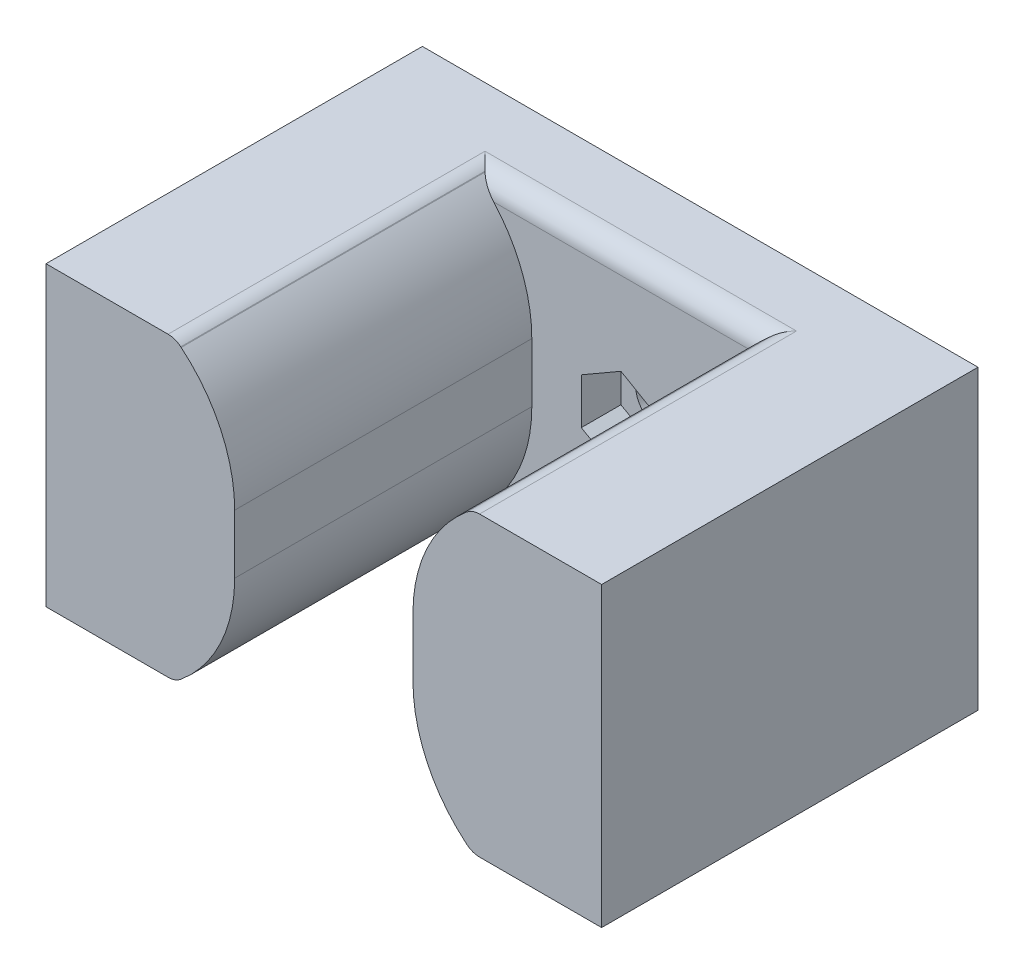
ISO-10303-21;
HEADER;
FILE_DESCRIPTION(('STEP AP214'),'2;1');
FILE_NAME('part.step','',(''),(''),'','','');
FILE_SCHEMA(('AUTOMOTIVE_DESIGN { 1 0 10303 214 1 1 1 1 }'));
ENDSEC;
DATA;
#1=APPLICATION_CONTEXT('core data for automotive mechanical design processes');
#2=APPLICATION_PROTOCOL_DEFINITION('international standard','automotive_design',2000,#1);
#3=PRODUCT_CONTEXT('',#1,'mechanical');
#4=PRODUCT('Part','Part','',(#3));
#5=PRODUCT_RELATED_PRODUCT_CATEGORY('part','',(#4));
#6=PRODUCT_DEFINITION_FORMATION('','',#4);
#7=PRODUCT_DEFINITION_CONTEXT('part definition',#1,'design');
#8=PRODUCT_DEFINITION('design','',#6,#7);
#9=PRODUCT_DEFINITION_SHAPE('','',#8);
#10=(LENGTH_UNIT() NAMED_UNIT(*) SI_UNIT(.MILLI.,.METRE.));
#11=(NAMED_UNIT(*) PLANE_ANGLE_UNIT() SI_UNIT($,.RADIAN.));
#12=(NAMED_UNIT(*) SI_UNIT($,.STERADIAN.) SOLID_ANGLE_UNIT());
#13=UNCERTAINTY_MEASURE_WITH_UNIT(LENGTH_MEASURE(1.E-05),#10,'distance_accuracy_value','');
#14=(GEOMETRIC_REPRESENTATION_CONTEXT(3) GLOBAL_UNCERTAINTY_ASSIGNED_CONTEXT((#13)) GLOBAL_UNIT_ASSIGNED_CONTEXT((#10,
#11,#12)) REPRESENTATION_CONTEXT('',''));
#15=CARTESIAN_POINT('',(0.,0.,0.));
#16=DIRECTION('',(0.,0.,1.));
#17=DIRECTION('',(1.,0.,0.));
#18=AXIS2_PLACEMENT_3D('',#15,#16,#17);
#19=CARTESIAN_POINT('',(0.,0.,8.));
#20=DIRECTION('',(0.,0.,-1.));
#21=DIRECTION('',(-1.,0.,0.));
#22=AXIS2_PLACEMENT_3D('',#19,#20,#21);
#23=PLANE('',#22);
#24=DIRECTION('',(-0.866025403784438,-0.5,0.));
#25=VECTOR('',#24,1.);
#26=CARTESIAN_POINT('',(28.05,19.618802153517,8.));
#27=LINE('',#26,#25);
#28=CARTESIAN_POINT('',(28.05,19.618802153517,8.));
#29=VERTEX_POINT('',#28);
#30=CARTESIAN_POINT('',(24.05,17.3094010767585,8.));
#31=VERTEX_POINT('',#30);
#32=EDGE_CURVE('E281',#29,#31,#27,.T.);
#33=ORIENTED_EDGE('',*,*,#32,.F.);
#34=DIRECTION('',(-0.866025403784438,0.500000000000001,0.));
#35=VECTOR('',#34,1.);
#36=CARTESIAN_POINT('',(32.05,17.3094010767585,8.));
#37=LINE('',#36,#35);
#38=CARTESIAN_POINT('',(32.05,17.3094010767585,8.));
#39=VERTEX_POINT('',#38);
#40=EDGE_CURVE('E65',#39,#29,#37,.T.);
#41=ORIENTED_EDGE('',*,*,#40,.F.);
#42=DIRECTION('',(0.,1.,0.));
#43=VECTOR('',#42,1.);
#44=CARTESIAN_POINT('',(32.05,12.6905989232415,8.));
#45=LINE('',#44,#43);
#46=CARTESIAN_POINT('',(32.05,12.6905989232415,8.));
#47=VERTEX_POINT('',#46);
#48=EDGE_CURVE('E258',#47,#39,#45,.T.);
#49=ORIENTED_EDGE('',*,*,#48,.F.);
#50=DIRECTION('',(0.866025403784439,0.5,0.));
#51=VECTOR('',#50,1.);
#52=CARTESIAN_POINT('',(28.05,10.381197846483,8.));
#53=LINE('',#52,#51);
#54=CARTESIAN_POINT('',(28.05,10.381197846483,8.));
#55=VERTEX_POINT('',#54);
#56=EDGE_CURVE('E262',#55,#47,#53,.T.);
#57=ORIENTED_EDGE('',*,*,#56,.F.);
#58=DIRECTION('',(0.866025403784439,-0.5,0.));
#59=VECTOR('',#58,1.);
#60=CARTESIAN_POINT('',(24.05,12.6905989232415,8.));
#61=LINE('',#60,#59);
#62=CARTESIAN_POINT('',(24.05,12.6905989232415,8.));
#63=VERTEX_POINT('',#62);
#64=EDGE_CURVE('E289',#63,#55,#61,.T.);
#65=ORIENTED_EDGE('',*,*,#64,.F.);
#66=DIRECTION('',(0.,-1.,0.));
#67=VECTOR('',#66,1.);
#68=CARTESIAN_POINT('',(24.05,17.3094010767585,8.));
#69=LINE('',#68,#67);
#70=EDGE_CURVE('E285',#31,#63,#69,.T.);
#71=ORIENTED_EDGE('',*,*,#70,.F.);
#72=EDGE_LOOP('',(#33,#41,#49,#57,#65,#71));
#73=FACE_BOUND('',#72,.T.);
#74=CARTESIAN_POINT('',(52.05,17.9743758102334,8.));
#75=DIRECTION('',(0.,0.,1.));
#76=DIRECTION('',(1.,0.,0.));
#77=AXIS2_PLACEMENT_3D('',#74,#75,#76);
#78=CIRCLE('',#77,15.);
#79=CARTESIAN_POINT('',(37.05,17.9743758102334,8.));
#80=VERTEX_POINT('',#79);
#81=CARTESIAN_POINT('',(40.8926320484818,28.,8.));
#82=VERTEX_POINT('',#81);
#83=EDGE_CURVE('E342',#80,#82,#78,.F.);
#84=ORIENTED_EDGE('',*,*,#83,.T.);
#85=DIRECTION('',(1.,0.,0.));
#86=VECTOR('',#85,1.);
#87=CARTESIAN_POINT('',(13.05,28.,8.));
#88=LINE('',#87,#86);
#89=CARTESIAN_POINT('',(15.2073679515182,28.,8.));
#90=VERTEX_POINT('',#89);
#91=EDGE_CURVE('E459',#82,#90,#88,.F.);
#92=ORIENTED_EDGE('',*,*,#91,.T.);
#93=CARTESIAN_POINT('',(4.05,17.9743758102334,8.));
#94=DIRECTION('',(0.,0.,1.));
#95=DIRECTION('',(1.,0.,0.));
#96=AXIS2_PLACEMENT_3D('',#93,#94,#95);
#97=CIRCLE('',#96,15.);
#98=CARTESIAN_POINT('',(19.05,17.9743758102334,8.));
#99=VERTEX_POINT('',#98);
#100=EDGE_CURVE('E400',#99,#90,#97,.T.);
#101=ORIENTED_EDGE('',*,*,#100,.F.);
#102=DIRECTION('',(0.,-1.,0.));
#103=VECTOR('',#102,1.);
#104=CARTESIAN_POINT('',(19.05,0.,8.));
#105=LINE('',#104,#103);
#106=CARTESIAN_POINT('',(19.05,12.0256241897666,8.));
#107=VERTEX_POINT('',#106);
#108=EDGE_CURVE('E365',#99,#107,#105,.T.);
#109=ORIENTED_EDGE('',*,*,#108,.T.);
#110=CARTESIAN_POINT('',(4.05,12.0256241897666,8.));
#111=DIRECTION('',(0.,0.,1.));
#112=DIRECTION('',(1.,0.,0.));
#113=AXIS2_PLACEMENT_3D('',#110,#111,#112);
#114=CIRCLE('',#113,15.);
#115=CARTESIAN_POINT('',(15.2073679515182,2.,8.));
#116=VERTEX_POINT('',#115);
#117=EDGE_CURVE('E371',#116,#107,#114,.T.);
#118=ORIENTED_EDGE('',*,*,#117,.F.);
#119=DIRECTION('',(1.,0.,0.));
#120=VECTOR('',#119,1.);
#121=CARTESIAN_POINT('',(0.,2.,8.));
#122=LINE('',#121,#120);
#123=CARTESIAN_POINT('',(40.8926320484818,2.,8.));
#124=VERTEX_POINT('',#123);
#125=EDGE_CURVE('E456',#116,#124,#122,.T.);
#126=ORIENTED_EDGE('',*,*,#125,.T.);
#127=CARTESIAN_POINT('',(52.05,12.0256241897666,8.));
#128=DIRECTION('',(0.,0.,1.));
#129=DIRECTION('',(1.,0.,0.));
#130=AXIS2_PLACEMENT_3D('',#127,#128,#129);
#131=CIRCLE('',#130,15.);
#132=CARTESIAN_POINT('',(37.05,12.0256241897666,8.));
#133=VERTEX_POINT('',#132);
#134=EDGE_CURVE('E316',#124,#133,#131,.F.);
#135=ORIENTED_EDGE('',*,*,#134,.T.);
#136=DIRECTION('',(0.,-1.,0.));
#137=VECTOR('',#136,1.);
#138=CARTESIAN_POINT('',(37.05,0.,8.));
#139=LINE('',#138,#137);
#140=EDGE_CURVE('E346',#80,#133,#139,.T.);
#141=ORIENTED_EDGE('',*,*,#140,.F.);
#142=EDGE_LOOP('',(#84,#92,#101,#109,#118,#126,#135,#141));
#143=FACE_BOUND('',#142,.T.);
#144=ADVANCED_FACE('F47',(#73,#143),#23,.F.);
#145=CARTESIAN_POINT('',(0.,0.,8.));
#146=DIRECTION('',(-1.,0.,0.));
#147=DIRECTION('',(0.,0.,1.));
#148=AXIS2_PLACEMENT_3D('',#145,#146,#147);
#149=PLANE('',#148);
#150=DIRECTION('',(0.,1.,0.));
#151=VECTOR('',#150,1.);
#152=CARTESIAN_POINT('',(0.,0.,0.));
#153=LINE('',#152,#151);
#154=CARTESIAN_POINT('',(0.,0.,0.));
#155=VERTEX_POINT('',#154);
#156=CARTESIAN_POINT('',(0.,30.,0.));
#157=VERTEX_POINT('',#156);
#158=EDGE_CURVE('E418',#155,#157,#153,.T.);
#159=ORIENTED_EDGE('',*,*,#158,.F.);
#160=DIRECTION('',(0.,0.,-1.));
#161=VECTOR('',#160,1.);
#162=CARTESIAN_POINT('',(0.,0.,8.));
#163=LINE('',#162,#161);
#164=CARTESIAN_POINT('',(0.,0.,38.));
#165=VERTEX_POINT('',#164);
#166=EDGE_CURVE('E434',#165,#155,#163,.T.);
#167=ORIENTED_EDGE('',*,*,#166,.F.);
#168=DIRECTION('',(0.,-1.,0.));
#169=VECTOR('',#168,1.);
#170=CARTESIAN_POINT('',(0.,0.,38.));
#171=LINE('',#170,#169);
#172=CARTESIAN_POINT('',(0.,30.,38.));
#173=VERTEX_POINT('',#172);
#174=EDGE_CURVE('E381',#173,#165,#171,.T.);
#175=ORIENTED_EDGE('',*,*,#174,.F.);
#176=DIRECTION('',(0.,0.,-1.));
#177=VECTOR('',#176,1.);
#178=CARTESIAN_POINT('',(0.,30.,8.));
#179=LINE('',#178,#177);
#180=EDGE_CURVE('E433',#173,#157,#179,.T.);
#181=ORIENTED_EDGE('',*,*,#180,.T.);
#182=EDGE_LOOP('',(#159,#167,#175,#181));
#183=FACE_BOUND('',#182,.T.);
#184=ADVANCED_FACE('F614',(#183),#149,.T.);
#185=CARTESIAN_POINT('',(0.,0.,8.));
#186=DIRECTION('',(0.,1.,0.));
#187=DIRECTION('',(0.,0.,1.));
#188=AXIS2_PLACEMENT_3D('',#185,#186,#187);
#189=PLANE('',#188);
#190=DIRECTION('',(1.,0.,0.));
#191=VECTOR('',#190,1.);
#192=CARTESIAN_POINT('',(0.,0.,38.));
#193=LINE('',#192,#191);
#194=CARTESIAN_POINT('',(43.7740998703627,0.,38.));
#195=VERTEX_POINT('',#194);
#196=CARTESIAN_POINT('',(56.1,0.,38.));
#197=VERTEX_POINT('',#196);
#198=EDGE_CURVE('E327',#195,#197,#193,.T.);
#199=ORIENTED_EDGE('',*,*,#198,.F.);
#200=DIRECTION('',(0.,0.,-1.));
#201=VECTOR('',#200,1.);
#202=CARTESIAN_POINT('',(43.7740998703627,0.,8.));
#203=LINE('',#202,#201);
#204=CARTESIAN_POINT('',(43.7740998703627,0.,6.));
#205=VERTEX_POINT('',#204);
#206=EDGE_CURVE('E486',#195,#205,#203,.T.);
#207=ORIENTED_EDGE('',*,*,#206,.T.);
#208=DIRECTION('',(1.,0.,0.));
#209=VECTOR('',#208,1.);
#210=CARTESIAN_POINT('',(0.,0.,6.));
#211=LINE('',#210,#209);
#212=CARTESIAN_POINT('',(12.3259001296373,0.,6.));
#213=VERTEX_POINT('',#212);
#214=EDGE_CURVE('E483',#205,#213,#211,.F.);
#215=ORIENTED_EDGE('',*,*,#214,.T.);
#216=DIRECTION('',(0.,0.,-1.));
#217=VECTOR('',#216,1.);
#218=CARTESIAN_POINT('',(12.3259001296373,0.,38.));
#219=LINE('',#218,#217);
#220=CARTESIAN_POINT('',(12.3259001296373,0.,38.));
#221=VERTEX_POINT('',#220);
#222=EDGE_CURVE('E480',#213,#221,#219,.F.);
#223=ORIENTED_EDGE('',*,*,#222,.T.);
#224=DIRECTION('',(1.,0.,0.));
#225=VECTOR('',#224,1.);
#226=CARTESIAN_POINT('',(0.,0.,38.));
#227=LINE('',#226,#225);
#228=EDGE_CURVE('E385',#165,#221,#227,.T.);
#229=ORIENTED_EDGE('',*,*,#228,.F.);
#230=ORIENTED_EDGE('',*,*,#166,.T.);
#231=DIRECTION('',(1.,0.,0.));
#232=VECTOR('',#231,1.);
#233=CARTESIAN_POINT('',(0.,0.,0.));
#234=LINE('',#233,#232);
#235=CARTESIAN_POINT('',(56.1,0.,0.));
#236=VERTEX_POINT('',#235);
#237=EDGE_CURVE('E430',#155,#236,#234,.T.);
#238=ORIENTED_EDGE('',*,*,#237,.T.);
#239=DIRECTION('',(0.,0.,-1.));
#240=VECTOR('',#239,1.);
#241=CARTESIAN_POINT('',(56.1,0.,8.));
#242=LINE('',#241,#240);
#243=EDGE_CURVE('E438',#197,#236,#242,.T.);
#244=ORIENTED_EDGE('',*,*,#243,.F.);
#245=EDGE_LOOP('',(#199,#207,#215,#223,#229,#230,#238,#244));
#246=FACE_BOUND('',#245,.T.);
#247=ADVANCED_FACE('F621',(#246),#189,.F.);
#248=CARTESIAN_POINT('',(56.1,0.,8.));
#249=DIRECTION('',(-1.,0.,0.));
#250=DIRECTION('',(0.,0.,1.));
#251=AXIS2_PLACEMENT_3D('',#248,#249,#250);
#252=PLANE('',#251);
#253=DIRECTION('',(0.,1.,0.));
#254=VECTOR('',#253,1.);
#255=CARTESIAN_POINT('',(56.1,0.,0.));
#256=LINE('',#255,#254);
#257=CARTESIAN_POINT('',(56.1,30.,0.));
#258=VERTEX_POINT('',#257);
#259=EDGE_CURVE('E426',#236,#258,#256,.T.);
#260=ORIENTED_EDGE('',*,*,#259,.T.);
#261=DIRECTION('',(0.,0.,-1.));
#262=VECTOR('',#261,1.);
#263=CARTESIAN_POINT('',(56.1,30.,8.));
#264=LINE('',#263,#262);
#265=CARTESIAN_POINT('',(56.1,30.,38.));
#266=VERTEX_POINT('',#265);
#267=EDGE_CURVE('E442',#266,#258,#264,.T.);
#268=ORIENTED_EDGE('',*,*,#267,.F.);
#269=DIRECTION('',(0.,1.,0.));
#270=VECTOR('',#269,1.);
#271=CARTESIAN_POINT('',(56.1,0.,38.));
#272=LINE('',#271,#270);
#273=EDGE_CURVE('E330',#197,#266,#272,.T.);
#274=ORIENTED_EDGE('',*,*,#273,.F.);
#275=ORIENTED_EDGE('',*,*,#243,.T.);
#276=EDGE_LOOP('',(#260,#268,#274,#275));
#277=FACE_BOUND('',#276,.T.);
#278=ADVANCED_FACE('F634',(#277),#252,.F.);
#279=CARTESIAN_POINT('',(0.,30.,8.));
#280=DIRECTION('',(0.,1.,0.));
#281=DIRECTION('',(0.,0.,1.));
#282=AXIS2_PLACEMENT_3D('',#279,#280,#281);
#283=PLANE('',#282);
#284=DIRECTION('',(1.,0.,0.));
#285=VECTOR('',#284,1.);
#286=CARTESIAN_POINT('',(43.05,30.,6.));
#287=LINE('',#286,#285);
#288=CARTESIAN_POINT('',(12.3259001296373,30.,6.));
#289=VERTEX_POINT('',#288);
#290=CARTESIAN_POINT('',(43.7740998703627,30.,6.));
#291=VERTEX_POINT('',#290);
#292=EDGE_CURVE('E449',#289,#291,#287,.T.);
#293=ORIENTED_EDGE('',*,*,#292,.T.);
#294=DIRECTION('',(0.,0.,-1.));
#295=VECTOR('',#294,1.);
#296=CARTESIAN_POINT('',(43.7740998703627,30.,38.));
#297=LINE('',#296,#295);
#298=CARTESIAN_POINT('',(43.7740998703627,30.,38.));
#299=VERTEX_POINT('',#298);
#300=EDGE_CURVE('E453',#291,#299,#297,.F.);
#301=ORIENTED_EDGE('',*,*,#300,.T.);
#302=DIRECTION('',(-1.,0.,0.));
#303=VECTOR('',#302,1.);
#304=CARTESIAN_POINT('',(0.,30.,38.));
#305=LINE('',#304,#303);
#306=EDGE_CURVE('E334',#266,#299,#305,.T.);
#307=ORIENTED_EDGE('',*,*,#306,.F.);
#308=ORIENTED_EDGE('',*,*,#267,.T.);
#309=DIRECTION('',(1.,0.,0.));
#310=VECTOR('',#309,1.);
#311=CARTESIAN_POINT('',(0.,30.,0.));
#312=LINE('',#311,#310);
#313=EDGE_CURVE('E422',#157,#258,#312,.T.);
#314=ORIENTED_EDGE('',*,*,#313,.F.);
#315=ORIENTED_EDGE('',*,*,#180,.F.);
#316=DIRECTION('',(-1.,0.,0.));
#317=VECTOR('',#316,1.);
#318=CARTESIAN_POINT('',(0.,30.,38.));
#319=LINE('',#318,#317);
#320=CARTESIAN_POINT('',(12.3259001296373,30.,38.));
#321=VERTEX_POINT('',#320);
#322=EDGE_CURVE('E378',#321,#173,#319,.T.);
#323=ORIENTED_EDGE('',*,*,#322,.F.);
#324=DIRECTION('',(0.,0.,-1.));
#325=VECTOR('',#324,1.);
#326=CARTESIAN_POINT('',(12.3259001296373,30.,8.));
#327=LINE('',#326,#325);
#328=EDGE_CURVE('E437',#321,#289,#327,.T.);
#329=ORIENTED_EDGE('',*,*,#328,.T.);
#330=EDGE_LOOP('',(#293,#301,#307,#308,#314,#315,#323,#329));
#331=FACE_BOUND('',#330,.T.);
#332=ADVANCED_FACE('F630',(#331),#283,.T.);
#333=CARTESIAN_POINT('',(0.,0.,0.));
#334=DIRECTION('',(0.,0.,-1.));
#335=DIRECTION('',(-1.,0.,0.));
#336=AXIS2_PLACEMENT_3D('',#333,#334,#335);
#337=PLANE('',#336);
#338=CARTESIAN_POINT('',(28.05,15.,0.));
#339=DIRECTION('',(0.,0.,-1.));
#340=DIRECTION('',(-1.,0.,0.));
#341=AXIS2_PLACEMENT_3D('',#338,#339,#340);
#342=CIRCLE('',#341,2.5);
#343=CARTESIAN_POINT('',(25.55,15.,0.));
#344=VERTEX_POINT('',#343);
#345=EDGE_CURVE('E265',#344,#344,#342,.F.);
#346=ORIENTED_EDGE('',*,*,#345,.T.);
#347=EDGE_LOOP('',(#346));
#348=FACE_BOUND('',#347,.T.);
#349=ORIENTED_EDGE('',*,*,#158,.T.);
#350=ORIENTED_EDGE('',*,*,#313,.T.);
#351=ORIENTED_EDGE('',*,*,#259,.F.);
#352=ORIENTED_EDGE('',*,*,#237,.F.);
#353=EDGE_LOOP('',(#349,#350,#351,#352));
#354=FACE_BOUND('',#353,.T.);
#355=ADVANCED_FACE('F627',(#348,#354),#337,.T.);
#356=CARTESIAN_POINT('',(19.05,0.,38.));
#357=DIRECTION('',(1.,0.,0.));
#358=DIRECTION('',(0.,1.,0.));
#359=AXIS2_PLACEMENT_3D('',#356,#357,#358);
#360=PLANE('',#359);
#361=ORIENTED_EDGE('',*,*,#108,.F.);
#362=DIRECTION('',(0.,0.,-1.));
#363=VECTOR('',#362,1.);
#364=CARTESIAN_POINT('',(19.05,17.9743758102334,38.));
#365=LINE('',#364,#363);
#366=CARTESIAN_POINT('',(19.05,17.9743758102334,38.));
#367=VERTEX_POINT('',#366);
#368=EDGE_CURVE('E414',#367,#99,#365,.T.);
#369=ORIENTED_EDGE('',*,*,#368,.F.);
#370=DIRECTION('',(0.,-1.,0.));
#371=VECTOR('',#370,1.);
#372=CARTESIAN_POINT('',(19.05,0.,38.));
#373=LINE('',#372,#371);
#374=CARTESIAN_POINT('',(19.05,12.0256241897666,38.));
#375=VERTEX_POINT('',#374);
#376=EDGE_CURVE('E366',#367,#375,#373,.T.);
#377=ORIENTED_EDGE('',*,*,#376,.T.);
#378=DIRECTION('',(0.,0.,-1.));
#379=VECTOR('',#378,1.);
#380=CARTESIAN_POINT('',(19.05,12.0256241897666,38.));
#381=LINE('',#380,#379);
#382=EDGE_CURVE('E396',#375,#107,#381,.T.);
#383=ORIENTED_EDGE('',*,*,#382,.T.);
#384=EDGE_LOOP('',(#361,#369,#377,#383));
#385=FACE_BOUND('',#384,.T.);
#386=ADVANCED_FACE('F626',(#385),#360,.T.);
#387=CARTESIAN_POINT('',(4.05,17.9743758102334,38.));
#388=DIRECTION('',(0.,0.,-1.));
#389=DIRECTION('',(-1.,0.,0.));
#390=AXIS2_PLACEMENT_3D('',#387,#388,#389);
#391=CYLINDRICAL_SURFACE('',#390,15.);
#392=ORIENTED_EDGE('',*,*,#100,.T.);
#393=CARTESIAN_POINT('',(15.2073679515182,28.,8.));
#394=CARTESIAN_POINT('',(15.1364010197319,28.078994207894,7.99997838340194));
#395=CARTESIAN_POINT('',(15.0646011608223,28.1571965324572,7.99532065499818));
#396=CARTESIAN_POINT('',(14.9199166148373,28.3114937279831,7.97712562352008));
#397=CARTESIAN_POINT('',(14.8470323047986,28.3875893062496,7.96359133921718));
#398=CARTESIAN_POINT('',(14.7025939314465,28.5352782718445,7.9284928798584));
#399=CARTESIAN_POINT('',(14.6310539133636,28.6069371277689,7.90714434852875));
#400=CARTESIAN_POINT('',(14.4879661191217,28.7474398485025,7.85658558442278));
#401=CARTESIAN_POINT('',(14.4164183428031,28.816283485155,7.8273747159003));
#402=CARTESIAN_POINT('',(14.2860189953556,28.9393443523767,7.76677786481894));
#403=CARTESIAN_POINT('',(14.2270734929358,28.9940609865006,7.7366023993534));
#404=CARTESIAN_POINT('',(14.1100178853004,29.1010251512196,7.67083271810237));
#405=CARTESIAN_POINT('',(14.0519074191552,29.1532737723599,7.6352409255525));
#406=CARTESIAN_POINT('',(13.9357133506664,29.2561666642127,7.5576573058025));
#407=CARTESIAN_POINT('',(13.8776580389205,29.3067509952297,7.51554270499841));
#408=CARTESIAN_POINT('',(13.7635288549584,29.4047336536302,7.42518015405696));
#409=CARTESIAN_POINT('',(13.7074572956518,29.4521283166258,7.37692532771946));
#410=CARTESIAN_POINT('',(13.6527659949672,29.497695004194,7.32548469414488));
#411=B_SPLINE_CURVE_WITH_KNOTS('',3,(#393,#394,#395,#396,#397,#398,#399,#400,#401,#402,#403,
#404,#405,#406,#407,#408,#409,#410),.UNSPECIFIED.,.F.,.F.,(4,2,2,2,2,2,2,2,4),(0.,
0.318419269035514,0.636730304999939,0.94684848067185,1.25699173994092,1.51449899299887,
1.77189137556953,2.03490380648095,2.29821341057934),.UNSPECIFIED.);
#412=CARTESIAN_POINT('',(13.6527659949672,29.497695004194,7.32548469414487));
#413=VERTEX_POINT('',#412);
#414=EDGE_CURVE('E509',#90,#413,#411,.T.);
#415=ORIENTED_EDGE('',*,*,#414,.T.);
#416=DIRECTION('',(0.,0.,-1.));
#417=VECTOR('',#416,1.);
#418=CARTESIAN_POINT('',(13.6527659949672,29.497695004194,38.));
#419=LINE('',#418,#417);
#420=CARTESIAN_POINT('',(13.6527659949672,29.497695004194,38.));
#421=VERTEX_POINT('',#420);
#422=EDGE_CURVE('E411',#421,#413,#419,.T.);
#423=ORIENTED_EDGE('',*,*,#422,.F.);
#424=CARTESIAN_POINT('',(4.05,17.9743758102334,38.));
#425=DIRECTION('',(0.,0.,1.));
#426=DIRECTION('',(1.,0.,0.));
#427=AXIS2_PLACEMENT_3D('',#424,#425,#426);
#428=CIRCLE('',#427,15.);
#429=EDGE_CURVE('E370',#367,#421,#428,.T.);
#430=ORIENTED_EDGE('',*,*,#429,.F.);
#431=ORIENTED_EDGE('',*,*,#368,.T.);
#432=EDGE_LOOP('',(#392,#415,#423,#430,#431));
#433=FACE_BOUND('',#432,.T.);
#434=ADVANCED_FACE('F716',(#433),#391,.T.);
#435=CARTESIAN_POINT('',(20.1024590163935,24.1229508196721,38.));
#436=DIRECTION('',(0.640184399664481,0.768221279597375,0.));
#437=DIRECTION('',(-0.768221279597375,0.640184399664481,0.));
#438=AXIS2_PLACEMENT_3D('',#435,#436,#437);
#439=PLANE('',#438);
#440=CARTESIAN_POINT('',(15.45,28.,6.));
#441=DIRECTION('',(0.640184399664481,0.768221279597375,0.));
#442=DIRECTION('',(-0.768221279597375,0.640184399664481,0.));
#443=AXIS2_PLACEMENT_3D('',#440,#441,#442);
#444=ELLIPSE('',#443,3.12409987036266,2.);
#445=CARTESIAN_POINT('',(13.6062689289663,29.5364425591947,7.28036879932897));
#446=VERTEX_POINT('',#445);
#447=EDGE_CURVE('E564',#413,#446,#444,.F.);
#448=ORIENTED_EDGE('',*,*,#447,.T.);
#449=DIRECTION('',(0.,0.,-1.));
#450=VECTOR('',#449,1.);
#451=CARTESIAN_POINT('',(13.6062689289663,29.5364425591947,38.));
#452=LINE('',#451,#450);
#453=CARTESIAN_POINT('',(13.6062689289663,29.5364425591947,38.));
#454=VERTEX_POINT('',#453);
#455=EDGE_CURVE('E471',#446,#454,#452,.F.);
#456=ORIENTED_EDGE('',*,*,#455,.T.);
#457=DIRECTION('',(0.768221279597375,-0.640184399664481,0.));
#458=VECTOR('',#457,1.);
#459=CARTESIAN_POINT('',(20.1024590163935,24.1229508196721,38.));
#460=LINE('',#459,#458);
#461=EDGE_CURVE('E375',#454,#421,#460,.T.);
#462=ORIENTED_EDGE('',*,*,#461,.T.);
#463=ORIENTED_EDGE('',*,*,#422,.T.);
#464=EDGE_LOOP('',(#448,#456,#462,#463));
#465=FACE_BOUND('',#464,.T.);
#466=ADVANCED_FACE('F719',(#465),#439,.T.);
#467=CARTESIAN_POINT('',(5.34836065573767,-6.41803278688524,38.));
#468=DIRECTION('',(0.640184399664477,-0.768221279597378,0.));
#469=DIRECTION('',(0.768221279597378,0.640184399664477,0.));
#470=AXIS2_PLACEMENT_3D('',#467,#468,#469);
#471=PLANE('',#470);
#472=DIRECTION('',(-0.768221279597378,-0.640184399664477,0.));
#473=VECTOR('',#472,1.);
#474=CARTESIAN_POINT('',(5.34836065573767,-6.41803278688524,38.));
#475=LINE('',#474,#473);
#476=CARTESIAN_POINT('',(13.6527659949672,0.502304995805996,38.));
#477=VERTEX_POINT('',#476);
#478=CARTESIAN_POINT('',(13.6062689289663,0.463557440805246,38.));
#479=VERTEX_POINT('',#478);
#480=EDGE_CURVE('E389',#477,#479,#475,.T.);
#481=ORIENTED_EDGE('',*,*,#480,.T.);
#482=DIRECTION('',(0.,0.,-1.));
#483=VECTOR('',#482,1.);
#484=CARTESIAN_POINT('',(13.6062689289663,0.463557440805246,8.));
#485=LINE('',#484,#483);
#486=CARTESIAN_POINT('',(13.6062689289663,0.463557440805246,7.28036879932896));
#487=VERTEX_POINT('',#486);
#488=EDGE_CURVE('E493',#479,#487,#485,.T.);
#489=ORIENTED_EDGE('',*,*,#488,.T.);
#490=CARTESIAN_POINT('',(15.45,2.,6.));
#491=DIRECTION('',(0.640184399664477,-0.768221279597378,0.));
#492=DIRECTION('',(0.768221279597378,0.640184399664477,0.));
#493=AXIS2_PLACEMENT_3D('',#490,#491,#492);
#494=ELLIPSE('',#493,3.12409987036267,2.);
#495=CARTESIAN_POINT('',(13.6527659949672,0.502304995805996,7.32548469414487));
#496=VERTEX_POINT('',#495);
#497=EDGE_CURVE('E57',#487,#496,#494,.F.);
#498=ORIENTED_EDGE('',*,*,#497,.T.);
#499=DIRECTION('',(0.,0.,-1.));
#500=VECTOR('',#499,1.);
#501=CARTESIAN_POINT('',(13.6527659949672,0.502304995805996,38.));
#502=LINE('',#501,#500);
#503=EDGE_CURVE('E72',#477,#496,#502,.T.);
#504=ORIENTED_EDGE('',*,*,#503,.F.);
#505=EDGE_LOOP('',(#481,#489,#498,#504));
#506=FACE_BOUND('',#505,.T.);
#507=ADVANCED_FACE('F536',(#506),#471,.T.);
#508=CARTESIAN_POINT('',(4.05,12.0256241897666,38.));
#509=DIRECTION('',(0.,0.,-1.));
#510=DIRECTION('',(-1.,0.,0.));
#511=AXIS2_PLACEMENT_3D('',#508,#509,#510);
#512=CYLINDRICAL_SURFACE('',#511,15.);
#513=ORIENTED_EDGE('',*,*,#503,.T.);
#514=CARTESIAN_POINT('',(13.6527659949672,0.502304995805996,7.32548469414487));
#515=CARTESIAN_POINT('',(13.7054888306372,0.546232709914975,7.37507918546172));
#516=CARTESIAN_POINT('',(13.7594979169966,0.591860793693974,7.42170917854039));
#517=CARTESIAN_POINT('',(13.8693971688525,0.686108137742405,7.50925428347499));
#518=CARTESIAN_POINT('',(13.9252855919425,0.734724660158358,7.55017451714186));
#519=CARTESIAN_POINT('',(14.0384586312911,0.834716285252309,7.62667654443475));
#520=CARTESIAN_POINT('',(14.0957457320905,0.886096526688042,7.66224789144895));
#521=CARTESIAN_POINT('',(14.2111556892483,0.991267778170509,7.72809393619407));
#522=CARTESIAN_POINT('',(14.2692787980021,1.04505952709991,7.75836699641033));
#523=CARTESIAN_POINT('',(14.4587838133128,1.2233304511454,7.84821592772636));
#524=CARTESIAN_POINT('',(14.5911107551457,1.35228653267758,7.89724030216739));
#525=CARTESIAN_POINT('',(14.8541041014704,1.61859650073199,7.96810812612382));
#526=CARTESIAN_POINT('',(14.9847734606816,1.75593176665286,7.99000969528178));
#527=CARTESIAN_POINT('',(15.1446347959692,1.93051043466516,7.99908894064817));
#528=CARTESIAN_POINT('',(15.1760872657182,1.96518406452759,7.99999643009194));
#529=CARTESIAN_POINT('',(15.2073679515182,2.,8.));
#530=B_SPLINE_CURVE_WITH_KNOTS('',3,(#514,#515,#516,#517,#518,#519,#520,#521,#522,#523,#524,
#525,#526,#527,#528,#529),.UNSPECIFIED.,.F.,.F.,(4,2,2,2,2,2,2,4),(0.,0.253851827934849,
0.507474459420806,0.761586167231693,1.0157762739005,1.58703617177933,2.15706982501783,
2.29750199771418),.UNSPECIFIED.);
#531=EDGE_CURVE('E11',#496,#116,#530,.T.);
#532=ORIENTED_EDGE('',*,*,#531,.T.);
#533=ORIENTED_EDGE('',*,*,#117,.T.);
#534=ORIENTED_EDGE('',*,*,#382,.F.);
#535=CARTESIAN_POINT('',(4.05,12.0256241897666,38.));
#536=DIRECTION('',(0.,0.,1.));
#537=DIRECTION('',(1.,0.,0.));
#538=AXIS2_PLACEMENT_3D('',#535,#536,#537);
#539=CIRCLE('',#538,15.);
#540=EDGE_CURVE('E393',#477,#375,#539,.T.);
#541=ORIENTED_EDGE('',*,*,#540,.F.);
#542=EDGE_LOOP('',(#513,#532,#533,#534,#541));
#543=FACE_BOUND('',#542,.T.);
#544=ADVANCED_FACE('F531',(#543),#512,.T.);
#545=CARTESIAN_POINT('',(0.,0.,38.));
#546=DIRECTION('',(0.,0.,1.));
#547=DIRECTION('',(1.,0.,0.));
#548=AXIS2_PLACEMENT_3D('',#545,#546,#547);
#549=PLANE('',#548);
#550=ORIENTED_EDGE('',*,*,#461,.F.);
#551=CARTESIAN_POINT('',(12.3259001296373,28.,38.));
#552=DIRECTION('',(0.,0.,1.));
#553=DIRECTION('',(1.,0.,0.));
#554=AXIS2_PLACEMENT_3D('',#551,#552,#553);
#555=CIRCLE('',#554,2.);
#556=EDGE_CURVE('E477',#454,#321,#555,.T.);
#557=ORIENTED_EDGE('',*,*,#556,.T.);
#558=ORIENTED_EDGE('',*,*,#322,.T.);
#559=ORIENTED_EDGE('',*,*,#174,.T.);
#560=ORIENTED_EDGE('',*,*,#228,.T.);
#561=CARTESIAN_POINT('',(12.3259001296373,2.,38.));
#562=DIRECTION('',(0.,0.,1.));
#563=DIRECTION('',(1.,0.,0.));
#564=AXIS2_PLACEMENT_3D('',#561,#562,#563);
#565=CIRCLE('',#564,2.);
#566=EDGE_CURVE('E474',#221,#479,#565,.T.);
#567=ORIENTED_EDGE('',*,*,#566,.T.);
#568=ORIENTED_EDGE('',*,*,#480,.F.);
#569=ORIENTED_EDGE('',*,*,#540,.T.);
#570=ORIENTED_EDGE('',*,*,#376,.F.);
#571=ORIENTED_EDGE('',*,*,#429,.T.);
#572=EDGE_LOOP('',(#550,#557,#558,#559,#560,#567,#568,#569,#570,#571));
#573=FACE_BOUND('',#572,.T.);
#574=ADVANCED_FACE('F526',(#573),#549,.T.);
#575=CARTESIAN_POINT('',(52.05,17.9743758102334,38.));
#576=DIRECTION('',(0.,0.,-1.));
#577=DIRECTION('',(-1.,0.,0.));
#578=AXIS2_PLACEMENT_3D('',#575,#576,#577);
#579=CYLINDRICAL_SURFACE('',#578,15.);
#580=ORIENTED_EDGE('',*,*,#83,.F.);
#581=DIRECTION('',(0.,0.,-1.));
#582=VECTOR('',#581,1.);
#583=CARTESIAN_POINT('',(37.05,17.9743758102334,38.));
#584=LINE('',#583,#582);
#585=CARTESIAN_POINT('',(37.05,17.9743758102334,38.));
#586=VERTEX_POINT('',#585);
#587=EDGE_CURVE('E362',#586,#80,#584,.T.);
#588=ORIENTED_EDGE('',*,*,#587,.F.);
#589=CARTESIAN_POINT('',(52.05,17.9743758102334,38.));
#590=DIRECTION('',(0.,0.,1.));
#591=DIRECTION('',(1.,0.,0.));
#592=AXIS2_PLACEMENT_3D('',#589,#590,#591);
#593=CIRCLE('',#592,15.);
#594=CARTESIAN_POINT('',(42.4472340050328,29.497695004194,38.));
#595=VERTEX_POINT('',#594);
#596=EDGE_CURVE('E311',#586,#595,#593,.F.);
#597=ORIENTED_EDGE('',*,*,#596,.T.);
#598=DIRECTION('',(0.,0.,-1.));
#599=VECTOR('',#598,1.);
#600=CARTESIAN_POINT('',(42.4472340050328,29.497695004194,38.));
#601=LINE('',#600,#599);
#602=CARTESIAN_POINT('',(42.4472340050328,29.497695004194,7.32548469414487));
#603=VERTEX_POINT('',#602);
#604=EDGE_CURVE('E341',#595,#603,#601,.T.);
#605=ORIENTED_EDGE('',*,*,#604,.T.);
#606=CARTESIAN_POINT('',(42.4472340050328,29.497695004194,7.32548469414487));
#607=CARTESIAN_POINT('',(42.3945111693628,29.453767290085,7.37507918546173));
#608=CARTESIAN_POINT('',(42.3405020830034,29.408139206306,7.4217091785404));
#609=CARTESIAN_POINT('',(42.2306028311475,29.3138918622576,7.50925428347499));
#610=CARTESIAN_POINT('',(42.1747144080575,29.2652753398416,7.55017451714187));
#611=CARTESIAN_POINT('',(42.0615413687089,29.1652837147477,7.62667654443475));
#612=CARTESIAN_POINT('',(42.0042542679095,29.113903473312,7.66224789144895));
#613=CARTESIAN_POINT('',(41.8888443107517,29.0087322218295,7.72809393619407));
#614=CARTESIAN_POINT('',(41.8307212019979,28.9549404729001,7.75836699641033));
#615=CARTESIAN_POINT('',(41.6412161866872,28.7766695488546,7.84821592772636));
#616=CARTESIAN_POINT('',(41.5088892448543,28.6477134673224,7.89724030216739));
#617=CARTESIAN_POINT('',(41.2458958985296,28.381403499268,7.96810812612382));
#618=CARTESIAN_POINT('',(41.1152265393184,28.2440682333471,7.99000969528178));
#619=CARTESIAN_POINT('',(40.9553652040308,28.0694895653348,7.99908894064817));
#620=CARTESIAN_POINT('',(40.9239127342818,28.0348159354724,7.99999643009194));
#621=CARTESIAN_POINT('',(40.8926320484818,28.,8.));
#622=B_SPLINE_CURVE_WITH_KNOTS('',3,(#606,#607,#608,#609,#610,#611,#612,#613,#614,#615,#616,
#617,#618,#619,#620,#621),.UNSPECIFIED.,.F.,.F.,(4,2,2,2,2,2,2,4),(0.,0.253851827934851,
0.50747445942081,0.761586167231696,1.0157762739005,1.58703617177933,2.15706982501783,
2.29750199771418),.UNSPECIFIED.);
#623=EDGE_CURVE('E500',#603,#82,#622,.T.);
#624=ORIENTED_EDGE('',*,*,#623,.T.);
#625=EDGE_LOOP('',(#580,#588,#597,#605,#624));
#626=FACE_BOUND('',#625,.T.);
#627=ADVANCED_FACE('F520',(#626),#579,.T.);
#628=CARTESIAN_POINT('',(37.05,0.,38.));
#629=DIRECTION('',(1.,0.,0.));
#630=DIRECTION('',(0.,0.,-1.));
#631=AXIS2_PLACEMENT_3D('',#628,#629,#630);
#632=PLANE('',#631);
#633=ORIENTED_EDGE('',*,*,#140,.T.);
#634=DIRECTION('',(0.,0.,-1.));
#635=VECTOR('',#634,1.);
#636=CARTESIAN_POINT('',(37.05,12.0256241897666,38.));
#637=LINE('',#636,#635);
#638=CARTESIAN_POINT('',(37.05,12.0256241897666,38.));
#639=VERTEX_POINT('',#638);
#640=EDGE_CURVE('E358',#639,#133,#637,.T.);
#641=ORIENTED_EDGE('',*,*,#640,.F.);
#642=DIRECTION('',(0.,-1.,0.));
#643=VECTOR('',#642,1.);
#644=CARTESIAN_POINT('',(37.05,0.,38.));
#645=LINE('',#644,#643);
#646=EDGE_CURVE('E315',#586,#639,#645,.T.);
#647=ORIENTED_EDGE('',*,*,#646,.F.);
#648=ORIENTED_EDGE('',*,*,#587,.T.);
#649=EDGE_LOOP('',(#633,#641,#647,#648));
#650=FACE_BOUND('',#649,.T.);
#651=ADVANCED_FACE('F525',(#650),#632,.F.);
#652=CARTESIAN_POINT('',(52.05,12.0256241897666,38.));
#653=DIRECTION('',(0.,0.,-1.));
#654=DIRECTION('',(-1.,0.,0.));
#655=AXIS2_PLACEMENT_3D('',#652,#653,#654);
#656=CYLINDRICAL_SURFACE('',#655,15.);
#657=ORIENTED_EDGE('',*,*,#134,.F.);
#658=CARTESIAN_POINT('',(40.8926320484818,2.,8.));
#659=CARTESIAN_POINT('',(40.9635989802681,1.92100579210601,7.99997838340194));
#660=CARTESIAN_POINT('',(41.0353988391777,1.84280346754277,7.99532065499818));
#661=CARTESIAN_POINT('',(41.1800833851627,1.68850627201687,7.97712562352008));
#662=CARTESIAN_POINT('',(41.2529676952015,1.61241069375037,7.96359133921717));
#663=CARTESIAN_POINT('',(41.3974060685535,1.46472172815553,7.9284928798584));
#664=CARTESIAN_POINT('',(41.4689460866364,1.39306287223106,7.90714434852875));
#665=CARTESIAN_POINT('',(41.6120338808784,1.2525601514975,7.85658558442278));
#666=CARTESIAN_POINT('',(41.6835816571969,1.18371651484495,7.8273747159003));
#667=CARTESIAN_POINT('',(41.8139810046445,1.06065564762331,7.76677786481894));
#668=CARTESIAN_POINT('',(41.8729265070642,1.00593901349937,7.7366023993534));
#669=CARTESIAN_POINT('',(41.9899821146996,0.898974848780429,7.67083271810237));
#670=CARTESIAN_POINT('',(42.0480925808448,0.846726227640122,7.6352409255525));
#671=CARTESIAN_POINT('',(42.1642866493336,0.743833335787267,7.5576573058025));
#672=CARTESIAN_POINT('',(42.2223419610795,0.693249004770264,7.51554270499841));
#673=CARTESIAN_POINT('',(42.3364711450417,0.595266346369754,7.42518015405696));
#674=CARTESIAN_POINT('',(42.3925427043483,0.54787168337425,7.37692532771946));
#675=CARTESIAN_POINT('',(42.4472340050328,0.502304995806,7.32548469414488));
#676=B_SPLINE_CURVE_WITH_KNOTS('',3,(#658,#659,#660,#661,#662,#663,#664,#665,#666,#667,#668,
#669,#670,#671,#672,#673,#674,#675),.UNSPECIFIED.,.F.,.F.,(4,2,2,2,2,2,2,2,4),(0.,
0.318419269035518,0.636730304999945,0.946848480671855,1.25699173994092,1.51449899299887,
1.77189137556953,2.03490380648095,2.29821341057933),.UNSPECIFIED.);
#677=CARTESIAN_POINT('',(42.4472340050328,0.502304995806002,7.32548469414487));
#678=VERTEX_POINT('',#677);
#679=EDGE_CURVE('E556',#124,#678,#676,.T.);
#680=ORIENTED_EDGE('',*,*,#679,.T.);
#681=DIRECTION('',(0.,0.,-1.));
#682=VECTOR('',#681,1.);
#683=CARTESIAN_POINT('',(42.4472340050328,0.502304995806002,38.));
#684=LINE('',#683,#682);
#685=CARTESIAN_POINT('',(42.4472340050328,0.502304995806002,38.));
#686=VERTEX_POINT('',#685);
#687=EDGE_CURVE('E355',#686,#678,#684,.T.);
#688=ORIENTED_EDGE('',*,*,#687,.F.);
#689=CARTESIAN_POINT('',(52.05,12.0256241897666,38.));
#690=DIRECTION('',(0.,0.,1.));
#691=DIRECTION('',(1.,0.,0.));
#692=AXIS2_PLACEMENT_3D('',#689,#690,#691);
#693=CIRCLE('',#692,15.);
#694=EDGE_CURVE('E319',#686,#639,#693,.F.);
#695=ORIENTED_EDGE('',*,*,#694,.T.);
#696=ORIENTED_EDGE('',*,*,#640,.T.);
#697=EDGE_LOOP('',(#657,#680,#688,#695,#696));
#698=FACE_BOUND('',#697,.T.);
#699=ADVANCED_FACE('F565',(#698),#656,.T.);
#700=CARTESIAN_POINT('',(17.6434426229513,21.1721311475411,38.));
#701=DIRECTION('',(0.640184399664489,0.768221279597368,0.));
#702=DIRECTION('',(-0.768221279597368,0.640184399664489,0.));
#703=AXIS2_PLACEMENT_3D('',#700,#701,#702);
#704=PLANE('',#703);
#705=ORIENTED_EDGE('',*,*,#687,.T.);
#706=CARTESIAN_POINT('',(40.6500000000001,2.,6.));
#707=DIRECTION('',(0.640184399664489,0.768221279597368,0.));
#708=DIRECTION('',(0.768221279597368,-0.640184399664489,0.));
#709=AXIS2_PLACEMENT_3D('',#706,#707,#708);
#710=ELLIPSE('',#709,3.12409987036262,2.);
#711=CARTESIAN_POINT('',(42.4937310710337,0.463557440805263,7.28036879932898));
#712=VERTEX_POINT('',#711);
#713=EDGE_CURVE('E563',#678,#712,#710,.T.);
#714=ORIENTED_EDGE('',*,*,#713,.T.);
#715=DIRECTION('',(0.,0.,-1.));
#716=VECTOR('',#715,1.);
#717=CARTESIAN_POINT('',(42.4937310710337,0.463557440805264,38.));
#718=LINE('',#717,#716);
#719=CARTESIAN_POINT('',(42.4937310710337,0.463557440805257,38.));
#720=VERTEX_POINT('',#719);
#721=EDGE_CURVE('E490',#712,#720,#718,.F.);
#722=ORIENTED_EDGE('',*,*,#721,.T.);
#723=DIRECTION('',(0.768221279597368,-0.640184399664489,0.));
#724=VECTOR('',#723,1.);
#725=CARTESIAN_POINT('',(17.6434426229513,21.1721311475411,38.));
#726=LINE('',#725,#724);
#727=EDGE_CURVE('E323',#686,#720,#726,.T.);
#728=ORIENTED_EDGE('',*,*,#727,.F.);
#729=EDGE_LOOP('',(#705,#714,#722,#728));
#730=FACE_BOUND('',#729,.T.);
#731=ADVANCED_FACE('F569',(#730),#704,.F.);
#732=CARTESIAN_POINT('',(2.88934426229537,-3.46721311475439,38.));
#733=DIRECTION('',(0.640184399664486,-0.768221279597371,0.));
#734=DIRECTION('',(0.768221279597371,0.640184399664486,0.));
#735=AXIS2_PLACEMENT_3D('',#732,#733,#734);
#736=PLANE('',#735);
#737=DIRECTION('',(-0.768221279597371,-0.640184399664486,0.));
#738=VECTOR('',#737,1.);
#739=CARTESIAN_POINT('',(2.88934426229537,-3.46721311475439,38.));
#740=LINE('',#739,#738);
#741=CARTESIAN_POINT('',(42.4937310710337,29.5364425591947,38.));
#742=VERTEX_POINT('',#741);
#743=EDGE_CURVE('E338',#742,#595,#740,.T.);
#744=ORIENTED_EDGE('',*,*,#743,.F.);
#745=DIRECTION('',(0.,0.,-1.));
#746=VECTOR('',#745,1.);
#747=CARTESIAN_POINT('',(42.4937310710337,29.5364425591947,8.));
#748=LINE('',#747,#746);
#749=CARTESIAN_POINT('',(42.4937310710337,29.5364425591947,7.28036879932898));
#750=VERTEX_POINT('',#749);
#751=EDGE_CURVE('E462',#742,#750,#748,.T.);
#752=ORIENTED_EDGE('',*,*,#751,.T.);
#753=CARTESIAN_POINT('',(40.65,28.,6.));
#754=DIRECTION('',(0.640184399664486,-0.768221279597371,0.));
#755=DIRECTION('',(-0.768221279597371,-0.640184399664486,0.));
#756=AXIS2_PLACEMENT_3D('',#753,#754,#755);
#757=ELLIPSE('',#756,3.12409987036263,2.);
#758=EDGE_CURVE('E496',#750,#603,#757,.T.);
#759=ORIENTED_EDGE('',*,*,#758,.T.);
#760=ORIENTED_EDGE('',*,*,#604,.F.);
#761=EDGE_LOOP('',(#744,#752,#759,#760));
#762=FACE_BOUND('',#761,.T.);
#763=ADVANCED_FACE('F573',(#762),#736,.F.);
#764=CARTESIAN_POINT('',(0.,0.,38.));
#765=DIRECTION('',(0.,0.,1.));
#766=DIRECTION('',(1.,0.,0.));
#767=AXIS2_PLACEMENT_3D('',#764,#765,#766);
#768=PLANE('',#767);
#769=ORIENTED_EDGE('',*,*,#306,.T.);
#770=CARTESIAN_POINT('',(43.7740998703627,28.,38.));
#771=DIRECTION('',(0.,0.,1.));
#772=DIRECTION('',(1.,0.,0.));
#773=AXIS2_PLACEMENT_3D('',#770,#771,#772);
#774=CIRCLE('',#773,2.);
#775=EDGE_CURVE('E468',#299,#742,#774,.T.);
#776=ORIENTED_EDGE('',*,*,#775,.T.);
#777=ORIENTED_EDGE('',*,*,#743,.T.);
#778=ORIENTED_EDGE('',*,*,#596,.F.);
#779=ORIENTED_EDGE('',*,*,#646,.T.);
#780=ORIENTED_EDGE('',*,*,#694,.F.);
#781=ORIENTED_EDGE('',*,*,#727,.T.);
#782=CARTESIAN_POINT('',(43.7740998703627,2.,38.));
#783=DIRECTION('',(0.,0.,1.));
#784=DIRECTION('',(1.,0.,0.));
#785=AXIS2_PLACEMENT_3D('',#782,#783,#784);
#786=CIRCLE('',#785,2.);
#787=EDGE_CURVE('E465',#720,#195,#786,.T.);
#788=ORIENTED_EDGE('',*,*,#787,.T.);
#789=ORIENTED_EDGE('',*,*,#198,.T.);
#790=ORIENTED_EDGE('',*,*,#273,.T.);
#791=EDGE_LOOP('',(#769,#776,#777,#778,#779,#780,#781,#788,#789,#790));
#792=FACE_BOUND('',#791,.T.);
#793=ADVANCED_FACE('F577',(#792),#768,.T.);
#794=CARTESIAN_POINT('',(12.3259001296373,28.,8.));
#795=DIRECTION('',(0.,0.,-1.));
#796=DIRECTION('',(-1.,0.,0.));
#797=AXIS2_PLACEMENT_3D('',#794,#795,#796);
#798=CYLINDRICAL_SURFACE('',#797,2.);
#799=ORIENTED_EDGE('',*,*,#455,.F.);
#800=CARTESIAN_POINT('',(12.3259001296373,28.,6.));
#801=DIRECTION('',(-0.707106781186547,0.,0.707106781186547));
#802=DIRECTION('',(-0.707106781186547,0.,-0.707106781186547));
#803=AXIS2_PLACEMENT_3D('',#800,#801,#802);
#804=ELLIPSE('',#803,2.82842712474619,2.);
#805=EDGE_CURVE('E347',#289,#446,#804,.F.);
#806=ORIENTED_EDGE('',*,*,#805,.F.);
#807=ORIENTED_EDGE('',*,*,#328,.F.);
#808=ORIENTED_EDGE('',*,*,#556,.F.);
#809=EDGE_LOOP('',(#799,#806,#807,#808));
#810=FACE_BOUND('',#809,.T.);
#811=ADVANCED_FACE('F581',(#810),#798,.T.);
#812=CARTESIAN_POINT('',(43.7740998703627,28.,38.));
#813=DIRECTION('',(0.,0.,1.));
#814=DIRECTION('',(1.,0.,0.));
#815=AXIS2_PLACEMENT_3D('',#812,#813,#814);
#816=CYLINDRICAL_SURFACE('',#815,2.);
#817=ORIENTED_EDGE('',*,*,#775,.F.);
#818=ORIENTED_EDGE('',*,*,#300,.F.);
#819=CARTESIAN_POINT('',(43.7740998703627,28.,6.));
#820=DIRECTION('',(-0.707106781186547,0.,-0.707106781186547));
#821=DIRECTION('',(-0.707106781186547,0.,0.707106781186547));
#822=AXIS2_PLACEMENT_3D('',#819,#820,#821);
#823=ELLIPSE('',#822,2.82842712474619,2.);
#824=EDGE_CURVE('E545',#750,#291,#823,.T.);
#825=ORIENTED_EDGE('',*,*,#824,.F.);
#826=ORIENTED_EDGE('',*,*,#751,.F.);
#827=EDGE_LOOP('',(#817,#818,#825,#826));
#828=FACE_BOUND('',#827,.T.);
#829=ADVANCED_FACE('F661',(#828),#816,.T.);
#830=CARTESIAN_POINT('',(0.,28.,6.));
#831=DIRECTION('',(-1.,0.,0.));
#832=DIRECTION('',(0.,0.,1.));
#833=AXIS2_PLACEMENT_3D('',#830,#831,#832);
#834=CYLINDRICAL_SURFACE('',#833,2.);
#835=ORIENTED_EDGE('',*,*,#414,.F.);
#836=ORIENTED_EDGE('',*,*,#91,.F.);
#837=ORIENTED_EDGE('',*,*,#623,.F.);
#838=ORIENTED_EDGE('',*,*,#758,.F.);
#839=ORIENTED_EDGE('',*,*,#824,.T.);
#840=ORIENTED_EDGE('',*,*,#292,.F.);
#841=ORIENTED_EDGE('',*,*,#805,.T.);
#842=ORIENTED_EDGE('',*,*,#447,.F.);
#843=EDGE_LOOP('',(#835,#836,#837,#838,#839,#840,#841,#842));
#844=FACE_BOUND('',#843,.T.);
#845=ADVANCED_FACE('F516',(#844),#834,.T.);
#846=CARTESIAN_POINT('',(12.3259001296373,2.,38.));
#847=DIRECTION('',(0.,0.,1.));
#848=DIRECTION('',(1.,0.,0.));
#849=AXIS2_PLACEMENT_3D('',#846,#847,#848);
#850=CYLINDRICAL_SURFACE('',#849,2.);
#851=ORIENTED_EDGE('',*,*,#566,.F.);
#852=ORIENTED_EDGE('',*,*,#222,.F.);
#853=CARTESIAN_POINT('',(12.3259001296373,2.,6.));
#854=DIRECTION('',(0.707106781186547,0.,-0.707106781186547));
#855=DIRECTION('',(0.707106781186547,0.,0.707106781186547));
#856=AXIS2_PLACEMENT_3D('',#853,#854,#855);
#857=ELLIPSE('',#856,2.82842712474619,2.);
#858=EDGE_CURVE('E51',#487,#213,#857,.T.);
#859=ORIENTED_EDGE('',*,*,#858,.F.);
#860=ORIENTED_EDGE('',*,*,#488,.F.);
#861=EDGE_LOOP('',(#851,#852,#859,#860));
#862=FACE_BOUND('',#861,.T.);
#863=ADVANCED_FACE('F49',(#862),#850,.T.);
#864=CARTESIAN_POINT('',(0.,2.,6.));
#865=DIRECTION('',(1.,0.,0.));
#866=DIRECTION('',(0.,0.,-1.));
#867=AXIS2_PLACEMENT_3D('',#864,#865,#866);
#868=CYLINDRICAL_SURFACE('',#867,2.);
#869=ORIENTED_EDGE('',*,*,#858,.T.);
#870=ORIENTED_EDGE('',*,*,#214,.F.);
#871=CARTESIAN_POINT('',(43.7740998703627,2.,6.));
#872=DIRECTION('',(-0.707106781186547,0.,-0.707106781186547));
#873=DIRECTION('',(0.707106781186547,0.,-0.707106781186547));
#874=AXIS2_PLACEMENT_3D('',#871,#872,#873);
#875=ELLIPSE('',#874,2.82842712474619,2.);
#876=EDGE_CURVE('E299',#712,#205,#875,.F.);
#877=ORIENTED_EDGE('',*,*,#876,.F.);
#878=ORIENTED_EDGE('',*,*,#713,.F.);
#879=ORIENTED_EDGE('',*,*,#679,.F.);
#880=ORIENTED_EDGE('',*,*,#125,.F.);
#881=ORIENTED_EDGE('',*,*,#531,.F.);
#882=ORIENTED_EDGE('',*,*,#497,.F.);
#883=EDGE_LOOP('',(#869,#870,#877,#878,#879,#880,#881,#882));
#884=FACE_BOUND('',#883,.T.);
#885=ADVANCED_FACE('F547',(#884),#868,.T.);
#886=CARTESIAN_POINT('',(43.7740998703627,2.,8.));
#887=DIRECTION('',(0.,0.,-1.));
#888=DIRECTION('',(-1.,0.,0.));
#889=AXIS2_PLACEMENT_3D('',#886,#887,#888);
#890=CYLINDRICAL_SURFACE('',#889,2.);
#891=ORIENTED_EDGE('',*,*,#787,.F.);
#892=ORIENTED_EDGE('',*,*,#721,.F.);
#893=ORIENTED_EDGE('',*,*,#876,.T.);
#894=ORIENTED_EDGE('',*,*,#206,.F.);
#895=EDGE_LOOP('',(#891,#892,#893,#894));
#896=FACE_BOUND('',#895,.T.);
#897=ADVANCED_FACE('F551',(#896),#890,.T.);
#898=CARTESIAN_POINT('',(32.05,17.3094010767585,4.));
#899=DIRECTION('',(0.500000000000001,0.866025403784438,0.));
#900=DIRECTION('',(-0.866025403784438,0.500000000000001,0.));
#901=AXIS2_PLACEMENT_3D('',#898,#899,#900);
#902=PLANE('',#901);
#903=ORIENTED_EDGE('',*,*,#40,.T.);
#904=DIRECTION('',(0.,0.,1.));
#905=VECTOR('',#904,1.);
#906=CARTESIAN_POINT('',(28.05,19.618802153517,4.));
#907=LINE('',#906,#905);
#908=CARTESIAN_POINT('',(28.05,19.618802153517,4.));
#909=VERTEX_POINT('',#908);
#910=EDGE_CURVE('E232',#909,#29,#907,.T.);
#911=ORIENTED_EDGE('',*,*,#910,.F.);
#912=DIRECTION('',(-0.866025403784438,0.500000000000001,0.));
#913=VECTOR('',#912,1.);
#914=CARTESIAN_POINT('',(32.05,17.3094010767585,4.));
#915=LINE('',#914,#913);
#916=CARTESIAN_POINT('',(32.05,17.3094010767585,4.));
#917=VERTEX_POINT('',#916);
#918=EDGE_CURVE('E236',#917,#909,#915,.T.);
#919=ORIENTED_EDGE('',*,*,#918,.F.);
#920=DIRECTION('',(0.,0.,1.));
#921=VECTOR('',#920,1.);
#922=CARTESIAN_POINT('',(32.05,17.3094010767585,4.));
#923=LINE('',#922,#921);
#924=EDGE_CURVE('E296',#917,#39,#923,.T.);
#925=ORIENTED_EDGE('',*,*,#924,.T.);
#926=EDGE_LOOP('',(#903,#911,#919,#925));
#927=FACE_BOUND('',#926,.T.);
#928=ADVANCED_FACE('F234',(#927),#902,.F.);
#929=CARTESIAN_POINT('',(32.05,12.6905989232415,4.));
#930=DIRECTION('',(1.,0.,0.));
#931=DIRECTION('',(0.,0.,-1.));
#932=AXIS2_PLACEMENT_3D('',#929,#930,#931);
#933=PLANE('',#932);
#934=ORIENTED_EDGE('',*,*,#48,.T.);
#935=ORIENTED_EDGE('',*,*,#924,.F.);
#936=DIRECTION('',(0.,1.,0.));
#937=VECTOR('',#936,1.);
#938=CARTESIAN_POINT('',(32.05,12.6905989232415,4.));
#939=LINE('',#938,#937);
#940=CARTESIAN_POINT('',(32.05,12.6905989232415,4.));
#941=VERTEX_POINT('',#940);
#942=EDGE_CURVE('E243',#941,#917,#939,.T.);
#943=ORIENTED_EDGE('',*,*,#942,.F.);
#944=DIRECTION('',(0.,0.,1.));
#945=VECTOR('',#944,1.);
#946=CARTESIAN_POINT('',(32.05,12.6905989232415,4.));
#947=LINE('',#946,#945);
#948=EDGE_CURVE('E300',#941,#47,#947,.T.);
#949=ORIENTED_EDGE('',*,*,#948,.T.);
#950=EDGE_LOOP('',(#934,#935,#943,#949));
#951=FACE_BOUND('',#950,.T.);
#952=ADVANCED_FACE('F585',(#951),#933,.F.);
#953=CARTESIAN_POINT('',(28.05,10.381197846483,4.));
#954=DIRECTION('',(0.5,-0.866025403784439,0.));
#955=DIRECTION('',(0.866025403784439,0.5,0.));
#956=AXIS2_PLACEMENT_3D('',#953,#954,#955);
#957=PLANE('',#956);
#958=ORIENTED_EDGE('',*,*,#56,.T.);
#959=ORIENTED_EDGE('',*,*,#948,.F.);
#960=DIRECTION('',(0.866025403784439,0.5,0.));
#961=VECTOR('',#960,1.);
#962=CARTESIAN_POINT('',(28.05,10.381197846483,4.));
#963=LINE('',#962,#961);
#964=CARTESIAN_POINT('',(28.05,10.381197846483,4.));
#965=VERTEX_POINT('',#964);
#966=EDGE_CURVE('E274',#965,#941,#963,.T.);
#967=ORIENTED_EDGE('',*,*,#966,.F.);
#968=DIRECTION('',(0.,0.,1.));
#969=VECTOR('',#968,1.);
#970=CARTESIAN_POINT('',(28.05,10.381197846483,4.));
#971=LINE('',#970,#969);
#972=EDGE_CURVE('E303',#965,#55,#971,.T.);
#973=ORIENTED_EDGE('',*,*,#972,.T.);
#974=EDGE_LOOP('',(#958,#959,#967,#973));
#975=FACE_BOUND('',#974,.T.);
#976=ADVANCED_FACE('F595',(#975),#957,.F.);
#977=CARTESIAN_POINT('',(24.05,12.6905989232415,4.));
#978=DIRECTION('',(-0.5,-0.866025403784439,0.));
#979=DIRECTION('',(0.866025403784439,-0.5,0.));
#980=AXIS2_PLACEMENT_3D('',#977,#978,#979);
#981=PLANE('',#980);
#982=ORIENTED_EDGE('',*,*,#64,.T.);
#983=ORIENTED_EDGE('',*,*,#972,.F.);
#984=DIRECTION('',(0.866025403784439,-0.5,0.));
#985=VECTOR('',#984,1.);
#986=CARTESIAN_POINT('',(24.05,12.6905989232415,4.));
#987=LINE('',#986,#985);
#988=CARTESIAN_POINT('',(24.05,12.6905989232415,4.));
#989=VERTEX_POINT('',#988);
#990=EDGE_CURVE('E270',#989,#965,#987,.T.);
#991=ORIENTED_EDGE('',*,*,#990,.F.);
#992=DIRECTION('',(0.,0.,1.));
#993=VECTOR('',#992,1.);
#994=CARTESIAN_POINT('',(24.05,12.6905989232415,4.));
#995=LINE('',#994,#993);
#996=EDGE_CURVE('E306',#989,#63,#995,.T.);
#997=ORIENTED_EDGE('',*,*,#996,.T.);
#998=EDGE_LOOP('',(#982,#983,#991,#997));
#999=FACE_BOUND('',#998,.T.);
#1000=ADVANCED_FACE('F591',(#999),#981,.F.);
#1001=CARTESIAN_POINT('',(24.05,17.3094010767585,4.));
#1002=DIRECTION('',(-1.,0.,0.));
#1003=DIRECTION('',(0.,0.,1.));
#1004=AXIS2_PLACEMENT_3D('',#1001,#1002,#1003);
#1005=PLANE('',#1004);
#1006=ORIENTED_EDGE('',*,*,#70,.T.);
#1007=ORIENTED_EDGE('',*,*,#996,.F.);
#1008=DIRECTION('',(0.,-1.,0.));
#1009=VECTOR('',#1008,1.);
#1010=CARTESIAN_POINT('',(24.05,17.3094010767585,4.));
#1011=LINE('',#1010,#1009);
#1012=CARTESIAN_POINT('',(24.05,17.3094010767585,4.));
#1013=VERTEX_POINT('',#1012);
#1014=EDGE_CURVE('E252',#1013,#989,#1011,.T.);
#1015=ORIENTED_EDGE('',*,*,#1014,.F.);
#1016=DIRECTION('',(0.,0.,1.));
#1017=VECTOR('',#1016,1.);
#1018=CARTESIAN_POINT('',(24.05,17.3094010767585,4.));
#1019=LINE('',#1018,#1017);
#1020=EDGE_CURVE('E242',#1013,#31,#1019,.T.);
#1021=ORIENTED_EDGE('',*,*,#1020,.T.);
#1022=EDGE_LOOP('',(#1006,#1007,#1015,#1021));
#1023=FACE_BOUND('',#1022,.T.);
#1024=ADVANCED_FACE('F588',(#1023),#1005,.F.);
#1025=CARTESIAN_POINT('',(28.05,19.618802153517,4.));
#1026=DIRECTION('',(-0.5,0.866025403784439,0.));
#1027=DIRECTION('',(-0.866025403784438,-0.5,0.));
#1028=AXIS2_PLACEMENT_3D('',#1025,#1026,#1027);
#1029=PLANE('',#1028);
#1030=ORIENTED_EDGE('',*,*,#32,.T.);
#1031=ORIENTED_EDGE('',*,*,#1020,.F.);
#1032=DIRECTION('',(-0.866025403784438,-0.5,0.));
#1033=VECTOR('',#1032,1.);
#1034=CARTESIAN_POINT('',(28.05,19.618802153517,4.));
#1035=LINE('',#1034,#1033);
#1036=EDGE_CURVE('E246',#909,#1013,#1035,.T.);
#1037=ORIENTED_EDGE('',*,*,#1036,.F.);
#1038=ORIENTED_EDGE('',*,*,#910,.T.);
#1039=EDGE_LOOP('',(#1030,#1031,#1037,#1038));
#1040=FACE_BOUND('',#1039,.T.);
#1041=ADVANCED_FACE('F247',(#1040),#1029,.F.);
#1042=CARTESIAN_POINT('',(0.,0.,4.));
#1043=DIRECTION('',(0.,0.,1.));
#1044=DIRECTION('',(1.,0.,0.));
#1045=AXIS2_PLACEMENT_3D('',#1042,#1043,#1044);
#1046=PLANE('',#1045);
#1047=CARTESIAN_POINT('',(28.05,15.,4.));
#1048=DIRECTION('',(0.,0.,1.));
#1049=DIRECTION('',(1.,0.,0.));
#1050=AXIS2_PLACEMENT_3D('',#1047,#1048,#1049);
#1051=CIRCLE('',#1050,2.5);
#1052=CARTESIAN_POINT('',(30.55,15.,4.));
#1053=VERTEX_POINT('',#1052);
#1054=EDGE_CURVE('E282',#1053,#1053,#1051,.T.);
#1055=ORIENTED_EDGE('',*,*,#1054,.F.);
#1056=EDGE_LOOP('',(#1055));
#1057=FACE_BOUND('',#1056,.T.);
#1058=ORIENTED_EDGE('',*,*,#918,.T.);
#1059=ORIENTED_EDGE('',*,*,#1036,.T.);
#1060=ORIENTED_EDGE('',*,*,#1014,.T.);
#1061=ORIENTED_EDGE('',*,*,#990,.T.);
#1062=ORIENTED_EDGE('',*,*,#966,.T.);
#1063=ORIENTED_EDGE('',*,*,#942,.T.);
#1064=EDGE_LOOP('',(#1058,#1059,#1060,#1061,#1062,#1063));
#1065=FACE_BOUND('',#1064,.T.);
#1066=ADVANCED_FACE('F254',(#1057,#1065),#1046,.T.);
#1067=CARTESIAN_POINT('',(28.05,15.,-0.00100000000000013));
#1068=DIRECTION('',(0.,0.,1.));
#1069=DIRECTION('',(1.,0.,0.));
#1070=AXIS2_PLACEMENT_3D('',#1067,#1068,#1069);
#1071=CYLINDRICAL_SURFACE('',#1070,2.5);
#1072=ORIENTED_EDGE('',*,*,#345,.F.);
#1073=EDGE_LOOP('',(#1072));
#1074=FACE_BOUND('',#1073,.T.);
#1075=ORIENTED_EDGE('',*,*,#1054,.T.);
#1076=EDGE_LOOP('',(#1075));
#1077=FACE_BOUND('',#1076,.T.);
#1078=ADVANCED_FACE('F605',(#1074,#1077),#1071,.F.);
#1079=CLOSED_SHELL('',(#144,#184,#247,#278,#332,#355,#386,#434,#466,#507,#544,#574,#627,#651,
#699,#731,#763,#793,#811,#829,#845,#863,#885,#897,#928,#952,#976,#1000,#1024,#1041,#1066,#1078));
#1080=MANIFOLD_SOLID_BREP('B2',#1079);
#1081=ADVANCED_BREP_SHAPE_REPRESENTATION('',(#18,#1080),#14);
#1082=SHAPE_DEFINITION_REPRESENTATION(#9,#1081);
ENDSEC;
END-ISO-10303-21;
